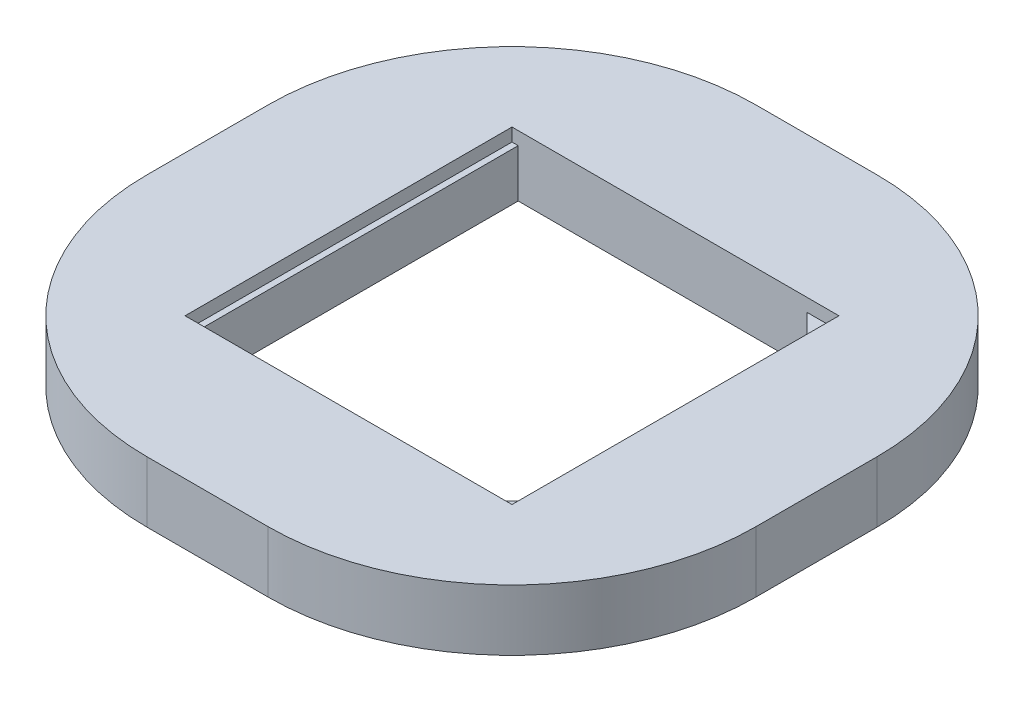
ISO-10303-21;
HEADER;
FILE_DESCRIPTION(('STEP AP214'),'2;1');
FILE_NAME('part.step','',(''),(''),'','','');
FILE_SCHEMA(('AUTOMOTIVE_DESIGN { 1 0 10303 214 1 1 1 1 }'));
ENDSEC;
DATA;
#1=APPLICATION_CONTEXT('core data for automotive mechanical design processes');
#2=APPLICATION_PROTOCOL_DEFINITION('international standard','automotive_design',2000,#1);
#3=PRODUCT_CONTEXT('',#1,'mechanical');
#4=PRODUCT('Part','Part','',(#3));
#5=PRODUCT_RELATED_PRODUCT_CATEGORY('part','',(#4));
#6=PRODUCT_DEFINITION_FORMATION('','',#4);
#7=PRODUCT_DEFINITION_CONTEXT('part definition',#1,'design');
#8=PRODUCT_DEFINITION('design','',#6,#7);
#9=PRODUCT_DEFINITION_SHAPE('','',#8);
#10=(LENGTH_UNIT() NAMED_UNIT(*) SI_UNIT(.MILLI.,.METRE.));
#11=(NAMED_UNIT(*) PLANE_ANGLE_UNIT() SI_UNIT($,.RADIAN.));
#12=(NAMED_UNIT(*) SI_UNIT($,.STERADIAN.) SOLID_ANGLE_UNIT());
#13=UNCERTAINTY_MEASURE_WITH_UNIT(LENGTH_MEASURE(1.E-05),#10,'distance_accuracy_value','');
#14=(GEOMETRIC_REPRESENTATION_CONTEXT(3) GLOBAL_UNCERTAINTY_ASSIGNED_CONTEXT((#13)) GLOBAL_UNIT_ASSIGNED_CONTEXT((#10,
#11,#12)) REPRESENTATION_CONTEXT('',''));
#15=CARTESIAN_POINT('',(0.,0.,0.));
#16=DIRECTION('',(0.,0.,1.));
#17=DIRECTION('',(1.,0.,0.));
#18=AXIS2_PLACEMENT_3D('',#15,#16,#17);
#19=CARTESIAN_POINT('',(0.,5.9,0.));
#20=DIRECTION('',(0.,-1.,0.));
#21=DIRECTION('',(0.,0.,-1.));
#22=AXIS2_PLACEMENT_3D('',#19,#20,#21);
#23=PLANE('',#22);
#24=DIRECTION('',(0.707106781186548,0.,-0.707106781186548));
#25=VECTOR('',#24,1.);
#26=CARTESIAN_POINT('',(16.1907074778435,5.9,20.1));
#27=LINE('',#26,#25);
#28=CARTESIAN_POINT('',(16.1907074778435,5.9,20.1));
#29=VERTEX_POINT('',#28);
#30=CARTESIAN_POINT('',(20.1,5.9,16.1907074778435));
#31=VERTEX_POINT('',#30);
#32=EDGE_CURVE('E182',#29,#31,#27,.T.);
#33=ORIENTED_EDGE('',*,*,#32,.F.);
#34=DIRECTION('',(1.,0.,0.));
#35=VECTOR('',#34,1.);
#36=CARTESIAN_POINT('',(-20.1,5.9,20.1));
#37=LINE('',#36,#35);
#38=CARTESIAN_POINT('',(20.1,5.9,20.1));
#39=VERTEX_POINT('',#38);
#40=EDGE_CURVE('E225',#29,#39,#37,.T.);
#41=ORIENTED_EDGE('',*,*,#40,.T.);
#42=DIRECTION('',(0.,0.,-1.));
#43=VECTOR('',#42,1.);
#44=CARTESIAN_POINT('',(20.1,5.9,20.1));
#45=LINE('',#44,#43);
#46=EDGE_CURVE('E215',#39,#31,#45,.T.);
#47=ORIENTED_EDGE('',*,*,#46,.T.);
#48=EDGE_LOOP('',(#33,#41,#47));
#49=FACE_BOUND('',#48,.T.);
#50=ADVANCED_FACE('F38',(#49),#23,.F.);
#51=DIRECTION('',(-0.707106781186548,0.,-0.707106781186548));
#52=VECTOR('',#51,1.);
#53=CARTESIAN_POINT('',(16.1907074778435,5.9,-20.1));
#54=LINE('',#53,#52);
#55=CARTESIAN_POINT('',(20.1,5.9,-16.1907074778435));
#56=VERTEX_POINT('',#55);
#57=CARTESIAN_POINT('',(16.1907074778435,5.9,-20.1));
#58=VERTEX_POINT('',#57);
#59=EDGE_CURVE('E192',#56,#58,#54,.T.);
#60=ORIENTED_EDGE('',*,*,#59,.F.);
#61=CARTESIAN_POINT('',(20.1,5.9,-20.1));
#62=VERTEX_POINT('',#61);
#63=EDGE_CURVE('E218',#56,#62,#45,.T.);
#64=ORIENTED_EDGE('',*,*,#63,.T.);
#65=DIRECTION('',(-1.,0.,0.));
#66=VECTOR('',#65,1.);
#67=CARTESIAN_POINT('',(-20.1,5.9,-20.1));
#68=LINE('',#67,#66);
#69=EDGE_CURVE('E219',#62,#58,#68,.T.);
#70=ORIENTED_EDGE('',*,*,#69,.T.);
#71=EDGE_LOOP('',(#60,#64,#70));
#72=FACE_BOUND('',#71,.T.);
#73=ADVANCED_FACE('F335',(#72),#23,.F.);
#74=DIRECTION('',(0.,0.,1.));
#75=VECTOR('',#74,1.);
#76=CARTESIAN_POINT('',(-19.336485636003,5.9,20.1));
#77=LINE('',#76,#75);
#78=CARTESIAN_POINT('',(-19.336485636003,5.9,-20.1));
#79=VERTEX_POINT('',#78);
#80=CARTESIAN_POINT('',(-19.336485636003,5.9,20.1));
#81=VERTEX_POINT('',#80);
#82=EDGE_CURVE('E189',#79,#81,#77,.T.);
#83=ORIENTED_EDGE('',*,*,#82,.F.);
#84=CARTESIAN_POINT('',(-20.1,5.9,-20.1));
#85=VERTEX_POINT('',#84);
#86=EDGE_CURVE('E217',#79,#85,#68,.T.);
#87=ORIENTED_EDGE('',*,*,#86,.T.);
#88=DIRECTION('',(0.,0.,1.));
#89=VECTOR('',#88,1.);
#90=CARTESIAN_POINT('',(-20.1,5.9,20.1));
#91=LINE('',#90,#89);
#92=CARTESIAN_POINT('',(-20.1,5.9,20.1));
#93=VERTEX_POINT('',#92);
#94=EDGE_CURVE('E222',#85,#93,#91,.T.);
#95=ORIENTED_EDGE('',*,*,#94,.T.);
#96=EDGE_CURVE('E226',#93,#81,#37,.T.);
#97=ORIENTED_EDGE('',*,*,#96,.T.);
#98=EDGE_LOOP('',(#83,#87,#95,#97));
#99=FACE_BOUND('',#98,.T.);
#100=ADVANCED_FACE('F338',(#99),#23,.F.);
#101=CARTESIAN_POINT('',(37.45,7.5,37.45));
#102=DIRECTION('',(-1.,0.,0.));
#103=DIRECTION('',(0.,0.,1.));
#104=AXIS2_PLACEMENT_3D('',#101,#102,#103);
#105=PLANE('',#104);
#106=DIRECTION('',(0.,0.,-1.));
#107=VECTOR('',#106,1.);
#108=CARTESIAN_POINT('',(37.45,0.,37.45));
#109=LINE('',#108,#107);
#110=CARTESIAN_POINT('',(37.45,0.,7.45000000000001));
#111=VERTEX_POINT('',#110);
#112=CARTESIAN_POINT('',(37.45,0.,-7.45000000000001));
#113=VERTEX_POINT('',#112);
#114=EDGE_CURVE('E242',#111,#113,#109,.T.);
#115=ORIENTED_EDGE('',*,*,#114,.T.);
#116=DIRECTION('',(0.,-1.,0.));
#117=VECTOR('',#116,1.);
#118=CARTESIAN_POINT('',(37.45,7.5,-7.45000000000001));
#119=LINE('',#118,#117);
#120=CARTESIAN_POINT('',(37.45,7.5,-7.45000000000001));
#121=VERTEX_POINT('',#120);
#122=EDGE_CURVE('E285',#113,#121,#119,.F.);
#123=ORIENTED_EDGE('',*,*,#122,.T.);
#124=DIRECTION('',(0.,0.,-1.));
#125=VECTOR('',#124,1.);
#126=CARTESIAN_POINT('',(37.45,7.5,37.45));
#127=LINE('',#126,#125);
#128=CARTESIAN_POINT('',(37.45,7.5,7.45000000000001));
#129=VERTEX_POINT('',#128);
#130=EDGE_CURVE('E249',#129,#121,#127,.T.);
#131=ORIENTED_EDGE('',*,*,#130,.F.);
#132=DIRECTION('',(0.,-1.,0.));
#133=VECTOR('',#132,1.);
#134=CARTESIAN_POINT('',(37.45,7.5,7.45000000000001));
#135=LINE('',#134,#133);
#136=EDGE_CURVE('E282',#129,#111,#135,.T.);
#137=ORIENTED_EDGE('',*,*,#136,.T.);
#138=EDGE_LOOP('',(#115,#123,#131,#137));
#139=FACE_BOUND('',#138,.T.);
#140=ADVANCED_FACE('F320',(#139),#105,.F.);
#141=CARTESIAN_POINT('',(-37.45,7.5,-37.45));
#142=DIRECTION('',(0.,0.,1.));
#143=DIRECTION('',(1.,0.,0.));
#144=AXIS2_PLACEMENT_3D('',#141,#142,#143);
#145=PLANE('',#144);
#146=DIRECTION('',(-1.,0.,0.));
#147=VECTOR('',#146,1.);
#148=CARTESIAN_POINT('',(-37.45,7.5,-37.45));
#149=LINE('',#148,#147);
#150=CARTESIAN_POINT('',(7.45000000000002,7.5,-37.45));
#151=VERTEX_POINT('',#150);
#152=CARTESIAN_POINT('',(-7.44999999999999,7.5,-37.45));
#153=VERTEX_POINT('',#152);
#154=EDGE_CURVE('E252',#151,#153,#149,.T.);
#155=ORIENTED_EDGE('',*,*,#154,.F.);
#156=DIRECTION('',(0.,-1.,0.));
#157=VECTOR('',#156,1.);
#158=CARTESIAN_POINT('',(7.45000000000002,7.5,-37.45));
#159=LINE('',#158,#157);
#160=CARTESIAN_POINT('',(7.45000000000002,0.,-37.45));
#161=VERTEX_POINT('',#160);
#162=EDGE_CURVE('E271',#151,#161,#159,.T.);
#163=ORIENTED_EDGE('',*,*,#162,.T.);
#164=DIRECTION('',(-1.,0.,0.));
#165=VECTOR('',#164,1.);
#166=CARTESIAN_POINT('',(-37.45,0.,-37.45));
#167=LINE('',#166,#165);
#168=CARTESIAN_POINT('',(-7.44999999999999,0.,-37.45));
#169=VERTEX_POINT('',#168);
#170=EDGE_CURVE('E263',#161,#169,#167,.T.);
#171=ORIENTED_EDGE('',*,*,#170,.T.);
#172=DIRECTION('',(0.,-1.,0.));
#173=VECTOR('',#172,1.);
#174=CARTESIAN_POINT('',(-7.44999999999999,7.5,-37.45));
#175=LINE('',#174,#173);
#176=EDGE_CURVE('E260',#169,#153,#175,.F.);
#177=ORIENTED_EDGE('',*,*,#176,.T.);
#178=EDGE_LOOP('',(#155,#163,#171,#177));
#179=FACE_BOUND('',#178,.T.);
#180=ADVANCED_FACE('F328',(#179),#145,.F.);
#181=CARTESIAN_POINT('',(-37.45,7.5,37.45));
#182=DIRECTION('',(1.,0.,0.));
#183=DIRECTION('',(0.,0.,-1.));
#184=AXIS2_PLACEMENT_3D('',#181,#182,#183);
#185=PLANE('',#184);
#186=DIRECTION('',(0.,0.,1.));
#187=VECTOR('',#186,1.);
#188=CARTESIAN_POINT('',(-37.45,0.,37.45));
#189=LINE('',#188,#187);
#190=CARTESIAN_POINT('',(-37.45,0.,-7.45000000000001));
#191=VERTEX_POINT('',#190);
#192=CARTESIAN_POINT('',(-37.45,0.,7.45000000000001));
#193=VERTEX_POINT('',#192);
#194=EDGE_CURVE('E266',#191,#193,#189,.T.);
#195=ORIENTED_EDGE('',*,*,#194,.T.);
#196=DIRECTION('',(0.,-1.,0.));
#197=VECTOR('',#196,1.);
#198=CARTESIAN_POINT('',(-37.45,7.5,7.45000000000001));
#199=LINE('',#198,#197);
#200=CARTESIAN_POINT('',(-37.45,7.5,7.45000000000001));
#201=VERTEX_POINT('',#200);
#202=EDGE_CURVE('E11',#193,#201,#199,.F.);
#203=ORIENTED_EDGE('',*,*,#202,.T.);
#204=DIRECTION('',(0.,0.,1.));
#205=VECTOR('',#204,1.);
#206=CARTESIAN_POINT('',(-37.45,7.5,37.45));
#207=LINE('',#206,#205);
#208=CARTESIAN_POINT('',(-37.45,7.5,-7.45000000000001));
#209=VERTEX_POINT('',#208);
#210=EDGE_CURVE('E256',#209,#201,#207,.T.);
#211=ORIENTED_EDGE('',*,*,#210,.F.);
#212=DIRECTION('',(0.,-1.,0.));
#213=VECTOR('',#212,1.);
#214=CARTESIAN_POINT('',(-37.45,7.5,-7.45000000000001));
#215=LINE('',#214,#213);
#216=EDGE_CURVE('E46',#209,#191,#215,.T.);
#217=ORIENTED_EDGE('',*,*,#216,.T.);
#218=EDGE_LOOP('',(#195,#203,#211,#217));
#219=FACE_BOUND('',#218,.T.);
#220=ADVANCED_FACE('F302',(#219),#185,.F.);
#221=CARTESIAN_POINT('',(-37.45,7.5,37.45));
#222=DIRECTION('',(0.,0.,-1.));
#223=DIRECTION('',(-1.,0.,0.));
#224=AXIS2_PLACEMENT_3D('',#221,#222,#223);
#225=PLANE('',#224);
#226=DIRECTION('',(1.,0.,0.));
#227=VECTOR('',#226,1.);
#228=CARTESIAN_POINT('',(-37.45,0.,37.45));
#229=LINE('',#228,#227);
#230=CARTESIAN_POINT('',(-7.44999999999999,0.,37.45));
#231=VERTEX_POINT('',#230);
#232=CARTESIAN_POINT('',(7.45000000000002,0.,37.45));
#233=VERTEX_POINT('',#232);
#234=EDGE_CURVE('E253',#231,#233,#229,.T.);
#235=ORIENTED_EDGE('',*,*,#234,.T.);
#236=DIRECTION('',(0.,-1.,0.));
#237=VECTOR('',#236,1.);
#238=CARTESIAN_POINT('',(7.45000000000002,7.5,37.45));
#239=LINE('',#238,#237);
#240=CARTESIAN_POINT('',(7.45000000000002,7.5,37.45));
#241=VERTEX_POINT('',#240);
#242=EDGE_CURVE('E53',#233,#241,#239,.F.);
#243=ORIENTED_EDGE('',*,*,#242,.T.);
#244=DIRECTION('',(1.,0.,0.));
#245=VECTOR('',#244,1.);
#246=CARTESIAN_POINT('',(-37.45,7.5,37.45));
#247=LINE('',#246,#245);
#248=CARTESIAN_POINT('',(-7.44999999999999,7.5,37.45));
#249=VERTEX_POINT('',#248);
#250=EDGE_CURVE('E258',#249,#241,#247,.T.);
#251=ORIENTED_EDGE('',*,*,#250,.F.);
#252=DIRECTION('',(0.,-1.,0.));
#253=VECTOR('',#252,1.);
#254=CARTESIAN_POINT('',(-7.44999999999999,7.5,37.45));
#255=LINE('',#254,#253);
#256=EDGE_CURVE('E294',#249,#231,#255,.T.);
#257=ORIENTED_EDGE('',*,*,#256,.T.);
#258=EDGE_LOOP('',(#235,#243,#251,#257));
#259=FACE_BOUND('',#258,.T.);
#260=ADVANCED_FACE('F311',(#259),#225,.F.);
#261=CARTESIAN_POINT('',(0.,7.5,0.));
#262=DIRECTION('',(0.,-1.,0.));
#263=DIRECTION('',(0.,0.,-1.));
#264=AXIS2_PLACEMENT_3D('',#261,#262,#263);
#265=PLANE('',#264);
#266=DIRECTION('',(-1.,0.,0.));
#267=VECTOR('',#266,1.);
#268=CARTESIAN_POINT('',(-20.1,7.5,-20.1));
#269=LINE('',#268,#267);
#270=CARTESIAN_POINT('',(20.1,7.5,-20.1));
#271=VERTEX_POINT('',#270);
#272=CARTESIAN_POINT('',(-20.1,7.5,-20.1));
#273=VERTEX_POINT('',#272);
#274=EDGE_CURVE('E231',#271,#273,#269,.T.);
#275=ORIENTED_EDGE('',*,*,#274,.F.);
#276=DIRECTION('',(0.,0.,-1.));
#277=VECTOR('',#276,1.);
#278=CARTESIAN_POINT('',(20.1,7.5,20.1));
#279=LINE('',#278,#277);
#280=CARTESIAN_POINT('',(20.1,7.5,20.1));
#281=VERTEX_POINT('',#280);
#282=EDGE_CURVE('E214',#281,#271,#279,.T.);
#283=ORIENTED_EDGE('',*,*,#282,.F.);
#284=DIRECTION('',(1.,0.,0.));
#285=VECTOR('',#284,1.);
#286=CARTESIAN_POINT('',(-20.1,7.5,20.1));
#287=LINE('',#286,#285);
#288=CARTESIAN_POINT('',(-20.1,7.5,20.1));
#289=VERTEX_POINT('',#288);
#290=EDGE_CURVE('E237',#289,#281,#287,.T.);
#291=ORIENTED_EDGE('',*,*,#290,.F.);
#292=DIRECTION('',(0.,0.,1.));
#293=VECTOR('',#292,1.);
#294=CARTESIAN_POINT('',(-20.1,7.5,20.1));
#295=LINE('',#294,#293);
#296=EDGE_CURVE('E234',#273,#289,#295,.T.);
#297=ORIENTED_EDGE('',*,*,#296,.F.);
#298=EDGE_LOOP('',(#275,#283,#291,#297));
#299=FACE_BOUND('',#298,.T.);
#300=ORIENTED_EDGE('',*,*,#130,.T.);
#301=CARTESIAN_POINT('',(7.45000000000002,7.5,-7.45000000000001));
#302=DIRECTION('',(0.,-1.,0.));
#303=DIRECTION('',(0.,0.,-1.));
#304=AXIS2_PLACEMENT_3D('',#301,#302,#303);
#305=CIRCLE('',#304,30.);
#306=EDGE_CURVE('E292',#121,#151,#305,.F.);
#307=ORIENTED_EDGE('',*,*,#306,.T.);
#308=ORIENTED_EDGE('',*,*,#154,.T.);
#309=CARTESIAN_POINT('',(-7.44999999999999,7.5,-7.45000000000001));
#310=DIRECTION('',(0.,-1.,0.));
#311=DIRECTION('',(0.,0.,-1.));
#312=AXIS2_PLACEMENT_3D('',#309,#310,#311);
#313=CIRCLE('',#312,30.);
#314=EDGE_CURVE('E287',#153,#209,#313,.F.);
#315=ORIENTED_EDGE('',*,*,#314,.T.);
#316=ORIENTED_EDGE('',*,*,#210,.T.);
#317=CARTESIAN_POINT('',(-7.44999999999999,7.5,7.45000000000001));
#318=DIRECTION('',(0.,-1.,0.));
#319=DIRECTION('',(0.,0.,-1.));
#320=AXIS2_PLACEMENT_3D('',#317,#318,#319);
#321=CIRCLE('',#320,30.);
#322=EDGE_CURVE('E60',#201,#249,#321,.F.);
#323=ORIENTED_EDGE('',*,*,#322,.T.);
#324=ORIENTED_EDGE('',*,*,#250,.T.);
#325=CARTESIAN_POINT('',(7.45000000000002,7.5,7.45000000000001));
#326=DIRECTION('',(0.,-1.,0.));
#327=DIRECTION('',(0.,0.,-1.));
#328=AXIS2_PLACEMENT_3D('',#325,#326,#327);
#329=CIRCLE('',#328,30.);
#330=EDGE_CURVE('E290',#241,#129,#329,.F.);
#331=ORIENTED_EDGE('',*,*,#330,.T.);
#332=EDGE_LOOP('',(#300,#307,#308,#315,#316,#323,#324,#331));
#333=FACE_BOUND('',#332,.T.);
#334=ADVANCED_FACE('F313',(#299,#333),#265,.F.);
#335=CARTESIAN_POINT('',(0.,0.,0.));
#336=DIRECTION('',(0.,-1.,0.));
#337=DIRECTION('',(0.,0.,-1.));
#338=AXIS2_PLACEMENT_3D('',#335,#336,#337);
#339=PLANE('',#338);
#340=DIRECTION('',(0.707106781186548,0.,-0.707106781186548));
#341=VECTOR('',#340,1.);
#342=CARTESIAN_POINT('',(16.1907074778435,0.,20.1));
#343=LINE('',#342,#341);
#344=CARTESIAN_POINT('',(16.1907074778435,0.,20.1));
#345=VERTEX_POINT('',#344);
#346=CARTESIAN_POINT('',(20.1,0.,16.1907074778435));
#347=VERTEX_POINT('',#346);
#348=EDGE_CURVE('E179',#345,#347,#343,.T.);
#349=ORIENTED_EDGE('',*,*,#348,.T.);
#350=DIRECTION('',(0.,0.,-1.));
#351=VECTOR('',#350,1.);
#352=CARTESIAN_POINT('',(20.1,0.,-16.1907074778435));
#353=LINE('',#352,#351);
#354=CARTESIAN_POINT('',(20.1,0.,-16.1907074778435));
#355=VERTEX_POINT('',#354);
#356=EDGE_CURVE('E164',#347,#355,#353,.T.);
#357=ORIENTED_EDGE('',*,*,#356,.T.);
#358=DIRECTION('',(-0.707106781186548,0.,-0.707106781186548));
#359=VECTOR('',#358,1.);
#360=CARTESIAN_POINT('',(16.1907074778435,0.,-20.1));
#361=LINE('',#360,#359);
#362=CARTESIAN_POINT('',(16.1907074778435,0.,-20.1));
#363=VERTEX_POINT('',#362);
#364=EDGE_CURVE('E207',#355,#363,#361,.T.);
#365=ORIENTED_EDGE('',*,*,#364,.T.);
#366=DIRECTION('',(-1.,0.,0.));
#367=VECTOR('',#366,1.);
#368=CARTESIAN_POINT('',(-19.336485636003,0.,-20.1));
#369=LINE('',#368,#367);
#370=CARTESIAN_POINT('',(-19.336485636003,0.,-20.1));
#371=VERTEX_POINT('',#370);
#372=EDGE_CURVE('E203',#363,#371,#369,.T.);
#373=ORIENTED_EDGE('',*,*,#372,.T.);
#374=DIRECTION('',(0.,0.,1.));
#375=VECTOR('',#374,1.);
#376=CARTESIAN_POINT('',(-19.336485636003,0.,20.1));
#377=LINE('',#376,#375);
#378=CARTESIAN_POINT('',(-19.336485636003,0.,20.1));
#379=VERTEX_POINT('',#378);
#380=EDGE_CURVE('E200',#371,#379,#377,.T.);
#381=ORIENTED_EDGE('',*,*,#380,.T.);
#382=DIRECTION('',(1.,0.,0.));
#383=VECTOR('',#382,1.);
#384=CARTESIAN_POINT('',(16.1907074778435,0.,20.1));
#385=LINE('',#384,#383);
#386=EDGE_CURVE('E188',#379,#345,#385,.T.);
#387=ORIENTED_EDGE('',*,*,#386,.T.);
#388=EDGE_LOOP('',(#349,#357,#365,#373,#381,#387));
#389=FACE_BOUND('',#388,.T.);
#390=ORIENTED_EDGE('',*,*,#170,.F.);
#391=CARTESIAN_POINT('',(7.45000000000002,0.,-7.45000000000001));
#392=DIRECTION('',(0.,-1.,0.));
#393=DIRECTION('',(0.,0.,-1.));
#394=AXIS2_PLACEMENT_3D('',#391,#392,#393);
#395=CIRCLE('',#394,30.);
#396=EDGE_CURVE('E280',#161,#113,#395,.T.);
#397=ORIENTED_EDGE('',*,*,#396,.T.);
#398=ORIENTED_EDGE('',*,*,#114,.F.);
#399=CARTESIAN_POINT('',(7.45000000000002,0.,7.45000000000001));
#400=DIRECTION('',(0.,-1.,0.));
#401=DIRECTION('',(0.,0.,-1.));
#402=AXIS2_PLACEMENT_3D('',#399,#400,#401);
#403=CIRCLE('',#402,30.);
#404=EDGE_CURVE('E278',#111,#233,#403,.T.);
#405=ORIENTED_EDGE('',*,*,#404,.T.);
#406=ORIENTED_EDGE('',*,*,#234,.F.);
#407=CARTESIAN_POINT('',(-7.44999999999999,0.,7.45000000000001));
#408=DIRECTION('',(0.,-1.,0.));
#409=DIRECTION('',(0.,0.,-1.));
#410=AXIS2_PLACEMENT_3D('',#407,#408,#409);
#411=CIRCLE('',#410,30.);
#412=EDGE_CURVE('E276',#231,#193,#411,.T.);
#413=ORIENTED_EDGE('',*,*,#412,.T.);
#414=ORIENTED_EDGE('',*,*,#194,.F.);
#415=CARTESIAN_POINT('',(-7.44999999999999,0.,-7.45000000000001));
#416=DIRECTION('',(0.,-1.,0.));
#417=DIRECTION('',(0.,0.,-1.));
#418=AXIS2_PLACEMENT_3D('',#415,#416,#417);
#419=CIRCLE('',#418,30.);
#420=EDGE_CURVE('E274',#191,#169,#419,.T.);
#421=ORIENTED_EDGE('',*,*,#420,.T.);
#422=EDGE_LOOP('',(#390,#397,#398,#405,#406,#413,#414,#421));
#423=FACE_BOUND('',#422,.T.);
#424=ADVANCED_FACE('F185',(#389,#423),#339,.T.);
#425=CARTESIAN_POINT('',(20.1,5.9,20.1));
#426=DIRECTION('',(1.,0.,0.));
#427=DIRECTION('',(0.,0.,-1.));
#428=AXIS2_PLACEMENT_3D('',#425,#426,#427);
#429=PLANE('',#428);
#430=ORIENTED_EDGE('',*,*,#282,.T.);
#431=DIRECTION('',(0.,1.,0.));
#432=VECTOR('',#431,1.);
#433=CARTESIAN_POINT('',(20.1,5.9,-20.1));
#434=LINE('',#433,#432);
#435=EDGE_CURVE('E229',#62,#271,#434,.T.);
#436=ORIENTED_EDGE('',*,*,#435,.F.);
#437=ORIENTED_EDGE('',*,*,#63,.F.);
#438=DIRECTION('',(0.,1.,0.));
#439=VECTOR('',#438,1.);
#440=CARTESIAN_POINT('',(20.1,-56.3140870415092,-16.1907074778435));
#441=LINE('',#440,#439);
#442=EDGE_CURVE('E171',#355,#56,#441,.T.);
#443=ORIENTED_EDGE('',*,*,#442,.F.);
#444=ORIENTED_EDGE('',*,*,#356,.F.);
#445=DIRECTION('',(0.,1.,0.));
#446=VECTOR('',#445,1.);
#447=CARTESIAN_POINT('',(20.1,-56.3140870415092,16.1907074778435));
#448=LINE('',#447,#446);
#449=EDGE_CURVE('E168',#347,#31,#448,.T.);
#450=ORIENTED_EDGE('',*,*,#449,.T.);
#451=ORIENTED_EDGE('',*,*,#46,.F.);
#452=DIRECTION('',(0.,1.,0.));
#453=VECTOR('',#452,1.);
#454=CARTESIAN_POINT('',(20.1,5.9,20.1));
#455=LINE('',#454,#453);
#456=EDGE_CURVE('E240',#39,#281,#455,.T.);
#457=ORIENTED_EDGE('',*,*,#456,.T.);
#458=EDGE_LOOP('',(#430,#436,#437,#443,#444,#450,#451,#457));
#459=FACE_BOUND('',#458,.T.);
#460=ADVANCED_FACE('F166',(#459),#429,.F.);
#461=CARTESIAN_POINT('',(-20.1,5.9,20.1));
#462=DIRECTION('',(0.,0.,1.));
#463=DIRECTION('',(1.,0.,0.));
#464=AXIS2_PLACEMENT_3D('',#461,#462,#463);
#465=PLANE('',#464);
#466=ORIENTED_EDGE('',*,*,#290,.T.);
#467=ORIENTED_EDGE('',*,*,#456,.F.);
#468=ORIENTED_EDGE('',*,*,#40,.F.);
#469=DIRECTION('',(0.,1.,0.));
#470=VECTOR('',#469,1.);
#471=CARTESIAN_POINT('',(16.1907074778435,-56.3140870415092,20.1));
#472=LINE('',#471,#470);
#473=EDGE_CURVE('E198',#345,#29,#472,.T.);
#474=ORIENTED_EDGE('',*,*,#473,.F.);
#475=ORIENTED_EDGE('',*,*,#386,.F.);
#476=DIRECTION('',(0.,1.,0.));
#477=VECTOR('',#476,1.);
#478=CARTESIAN_POINT('',(-19.336485636003,-56.3140870415092,20.1));
#479=LINE('',#478,#477);
#480=EDGE_CURVE('E199',#379,#81,#479,.T.);
#481=ORIENTED_EDGE('',*,*,#480,.T.);
#482=ORIENTED_EDGE('',*,*,#96,.F.);
#483=DIRECTION('',(0.,1.,0.));
#484=VECTOR('',#483,1.);
#485=CARTESIAN_POINT('',(-20.1,5.9,20.1));
#486=LINE('',#485,#484);
#487=EDGE_CURVE('E243',#93,#289,#486,.T.);
#488=ORIENTED_EDGE('',*,*,#487,.T.);
#489=EDGE_LOOP('',(#466,#467,#468,#474,#475,#481,#482,#488));
#490=FACE_BOUND('',#489,.T.);
#491=ADVANCED_FACE('F368',(#490),#465,.F.);
#492=CARTESIAN_POINT('',(-20.1,5.9,20.1));
#493=DIRECTION('',(-1.,0.,0.));
#494=DIRECTION('',(0.,0.,1.));
#495=AXIS2_PLACEMENT_3D('',#492,#493,#494);
#496=PLANE('',#495);
#497=ORIENTED_EDGE('',*,*,#296,.T.);
#498=ORIENTED_EDGE('',*,*,#487,.F.);
#499=ORIENTED_EDGE('',*,*,#94,.F.);
#500=DIRECTION('',(0.,1.,0.));
#501=VECTOR('',#500,1.);
#502=CARTESIAN_POINT('',(-20.1,5.9,-20.1));
#503=LINE('',#502,#501);
#504=EDGE_CURVE('E245',#85,#273,#503,.T.);
#505=ORIENTED_EDGE('',*,*,#504,.T.);
#506=EDGE_LOOP('',(#497,#498,#499,#505));
#507=FACE_BOUND('',#506,.T.);
#508=ADVANCED_FACE('F366',(#507),#496,.F.);
#509=CARTESIAN_POINT('',(-20.1,5.9,-20.1));
#510=DIRECTION('',(0.,0.,-1.));
#511=DIRECTION('',(-1.,0.,0.));
#512=AXIS2_PLACEMENT_3D('',#509,#510,#511);
#513=PLANE('',#512);
#514=ORIENTED_EDGE('',*,*,#274,.T.);
#515=ORIENTED_EDGE('',*,*,#504,.F.);
#516=ORIENTED_EDGE('',*,*,#86,.F.);
#517=DIRECTION('',(0.,1.,0.));
#518=VECTOR('',#517,1.);
#519=CARTESIAN_POINT('',(-19.336485636003,-56.3140870415092,-20.1));
#520=LINE('',#519,#518);
#521=EDGE_CURVE('E202',#371,#79,#520,.T.);
#522=ORIENTED_EDGE('',*,*,#521,.F.);
#523=ORIENTED_EDGE('',*,*,#372,.F.);
#524=DIRECTION('',(0.,1.,0.));
#525=VECTOR('',#524,1.);
#526=CARTESIAN_POINT('',(16.1907074778435,-56.3140870415092,-20.1));
#527=LINE('',#526,#525);
#528=EDGE_CURVE('E206',#363,#58,#527,.T.);
#529=ORIENTED_EDGE('',*,*,#528,.T.);
#530=ORIENTED_EDGE('',*,*,#69,.F.);
#531=ORIENTED_EDGE('',*,*,#435,.T.);
#532=EDGE_LOOP('',(#514,#515,#516,#522,#523,#529,#530,#531));
#533=FACE_BOUND('',#532,.T.);
#534=ADVANCED_FACE('F361',(#533),#513,.F.);
#535=CARTESIAN_POINT('',(16.1907074778435,-56.3140870415092,20.1));
#536=DIRECTION('',(0.707106781186547,0.,0.707106781186547));
#537=DIRECTION('',(0.707106781186548,0.,-0.707106781186548));
#538=AXIS2_PLACEMENT_3D('',#535,#536,#537);
#539=PLANE('',#538);
#540=ORIENTED_EDGE('',*,*,#473,.T.);
#541=ORIENTED_EDGE('',*,*,#32,.T.);
#542=ORIENTED_EDGE('',*,*,#449,.F.);
#543=ORIENTED_EDGE('',*,*,#348,.F.);
#544=EDGE_LOOP('',(#540,#541,#542,#543));
#545=FACE_BOUND('',#544,.T.);
#546=ADVANCED_FACE('F178',(#545),#539,.F.);
#547=CARTESIAN_POINT('',(16.1907074778435,-56.3140870415092,-20.1));
#548=DIRECTION('',(0.707106781186547,0.,-0.707106781186547));
#549=DIRECTION('',(-0.707106781186548,0.,-0.707106781186548));
#550=AXIS2_PLACEMENT_3D('',#547,#548,#549);
#551=PLANE('',#550);
#552=ORIENTED_EDGE('',*,*,#442,.T.);
#553=ORIENTED_EDGE('',*,*,#59,.T.);
#554=ORIENTED_EDGE('',*,*,#528,.F.);
#555=ORIENTED_EDGE('',*,*,#364,.F.);
#556=EDGE_LOOP('',(#552,#553,#554,#555));
#557=FACE_BOUND('',#556,.T.);
#558=ADVANCED_FACE('F374',(#557),#551,.F.);
#559=CARTESIAN_POINT('',(-19.336485636003,-56.3140870415092,20.1));
#560=DIRECTION('',(-1.,0.,0.));
#561=DIRECTION('',(0.,0.,1.));
#562=AXIS2_PLACEMENT_3D('',#559,#560,#561);
#563=PLANE('',#562);
#564=ORIENTED_EDGE('',*,*,#521,.T.);
#565=ORIENTED_EDGE('',*,*,#82,.T.);
#566=ORIENTED_EDGE('',*,*,#480,.F.);
#567=ORIENTED_EDGE('',*,*,#380,.F.);
#568=EDGE_LOOP('',(#564,#565,#566,#567));
#569=FACE_BOUND('',#568,.T.);
#570=ADVANCED_FACE('F369',(#569),#563,.F.);
#571=CARTESIAN_POINT('',(7.45000000000002,7.5,-7.45000000000001));
#572=DIRECTION('',(0.,-1.,0.));
#573=DIRECTION('',(0.,0.,-1.));
#574=AXIS2_PLACEMENT_3D('',#571,#572,#573);
#575=CYLINDRICAL_SURFACE('',#574,30.);
#576=ORIENTED_EDGE('',*,*,#306,.F.);
#577=ORIENTED_EDGE('',*,*,#122,.F.);
#578=ORIENTED_EDGE('',*,*,#396,.F.);
#579=ORIENTED_EDGE('',*,*,#162,.F.);
#580=EDGE_LOOP('',(#576,#577,#578,#579));
#581=FACE_BOUND('',#580,.T.);
#582=ADVANCED_FACE('F325',(#581),#575,.T.);
#583=CARTESIAN_POINT('',(7.45000000000002,7.5,7.45000000000001));
#584=DIRECTION('',(0.,-1.,0.));
#585=DIRECTION('',(0.,0.,-1.));
#586=AXIS2_PLACEMENT_3D('',#583,#584,#585);
#587=CYLINDRICAL_SURFACE('',#586,30.);
#588=ORIENTED_EDGE('',*,*,#330,.F.);
#589=ORIENTED_EDGE('',*,*,#242,.F.);
#590=ORIENTED_EDGE('',*,*,#404,.F.);
#591=ORIENTED_EDGE('',*,*,#136,.F.);
#592=EDGE_LOOP('',(#588,#589,#590,#591));
#593=FACE_BOUND('',#592,.T.);
#594=ADVANCED_FACE('F317',(#593),#587,.T.);
#595=CARTESIAN_POINT('',(-7.44999999999999,7.5,7.45000000000001));
#596=DIRECTION('',(0.,-1.,0.));
#597=DIRECTION('',(0.,0.,-1.));
#598=AXIS2_PLACEMENT_3D('',#595,#596,#597);
#599=CYLINDRICAL_SURFACE('',#598,30.);
#600=ORIENTED_EDGE('',*,*,#322,.F.);
#601=ORIENTED_EDGE('',*,*,#202,.F.);
#602=ORIENTED_EDGE('',*,*,#412,.F.);
#603=ORIENTED_EDGE('',*,*,#256,.F.);
#604=EDGE_LOOP('',(#600,#601,#602,#603));
#605=FACE_BOUND('',#604,.T.);
#606=ADVANCED_FACE('F310',(#605),#599,.T.);
#607=CARTESIAN_POINT('',(-7.44999999999999,7.5,-7.45000000000001));
#608=DIRECTION('',(0.,-1.,0.));
#609=DIRECTION('',(0.,0.,-1.));
#610=AXIS2_PLACEMENT_3D('',#607,#608,#609);
#611=CYLINDRICAL_SURFACE('',#610,30.);
#612=ORIENTED_EDGE('',*,*,#314,.F.);
#613=ORIENTED_EDGE('',*,*,#176,.F.);
#614=ORIENTED_EDGE('',*,*,#420,.F.);
#615=ORIENTED_EDGE('',*,*,#216,.F.);
#616=EDGE_LOOP('',(#612,#613,#614,#615));
#617=FACE_BOUND('',#616,.T.);
#618=ADVANCED_FACE('F40',(#617),#611,.T.);
#619=CLOSED_SHELL('',(#50,#73,#100,#140,#180,#220,#260,#334,#424,#460,#491,#508,#534,#546,#558,
#570,#582,#594,#606,#618));
#620=MANIFOLD_SOLID_BREP('B2',#619);
#621=ADVANCED_BREP_SHAPE_REPRESENTATION('',(#18,#620),#14);
#622=SHAPE_DEFINITION_REPRESENTATION(#9,#621);
ENDSEC;
END-ISO-10303-21;
